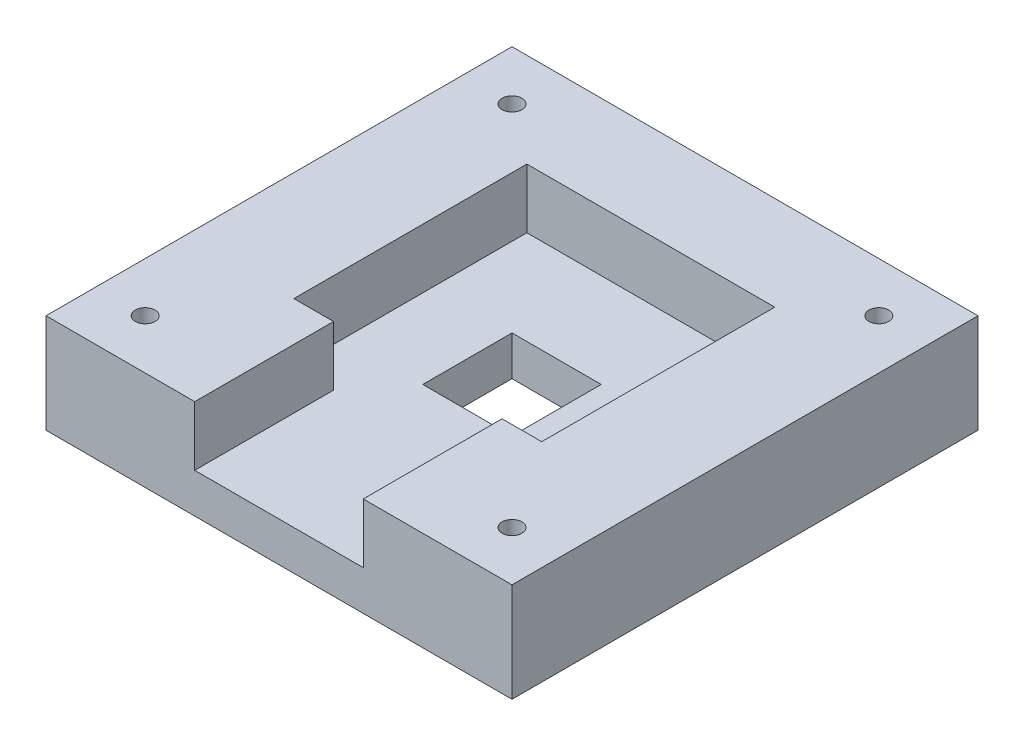
ISO-10303-21;
HEADER;
FILE_DESCRIPTION(('STEP AP214'),'2;1');
FILE_NAME('part.step','',(''),(''),'','','');
FILE_SCHEMA(('AUTOMOTIVE_DESIGN { 1 0 10303 214 1 1 1 1 }'));
ENDSEC;
DATA;
#1=APPLICATION_CONTEXT('core data for automotive mechanical design processes');
#2=APPLICATION_PROTOCOL_DEFINITION('international standard','automotive_design',2000,#1);
#3=PRODUCT_CONTEXT('',#1,'mechanical');
#4=PRODUCT('Part','Part','',(#3));
#5=PRODUCT_RELATED_PRODUCT_CATEGORY('part','',(#4));
#6=PRODUCT_DEFINITION_FORMATION('','',#4);
#7=PRODUCT_DEFINITION_CONTEXT('part definition',#1,'design');
#8=PRODUCT_DEFINITION('design','',#6,#7);
#9=PRODUCT_DEFINITION_SHAPE('','',#8);
#10=(LENGTH_UNIT() NAMED_UNIT(*) SI_UNIT(.MILLI.,.METRE.));
#11=(NAMED_UNIT(*) PLANE_ANGLE_UNIT() SI_UNIT($,.RADIAN.));
#12=(NAMED_UNIT(*) SI_UNIT($,.STERADIAN.) SOLID_ANGLE_UNIT());
#13=UNCERTAINTY_MEASURE_WITH_UNIT(LENGTH_MEASURE(1.E-05),#10,'distance_accuracy_value','');
#14=(GEOMETRIC_REPRESENTATION_CONTEXT(3) GLOBAL_UNCERTAINTY_ASSIGNED_CONTEXT((#13)) GLOBAL_UNIT_ASSIGNED_CONTEXT((#10,
#11,#12)) REPRESENTATION_CONTEXT('',''));
#15=CARTESIAN_POINT('',(0.,0.,0.));
#16=DIRECTION('',(0.,0.,1.));
#17=DIRECTION('',(1.,0.,0.));
#18=AXIS2_PLACEMENT_3D('',#15,#16,#17);
#19=CARTESIAN_POINT('',(0.,10.,47.));
#20=DIRECTION('',(0.,0.,-1.));
#21=DIRECTION('',(-1.,0.,0.));
#22=AXIS2_PLACEMENT_3D('',#19,#20,#21);
#23=PLANE('',#22);
#24=DIRECTION('',(0.,1.,0.));
#25=VECTOR('',#24,1.);
#26=CARTESIAN_POINT('',(32.,4.,47.));
#27=LINE('',#26,#25);
#28=CARTESIAN_POINT('',(32.,4.,47.));
#29=VERTEX_POINT('',#28);
#30=CARTESIAN_POINT('',(32.,10.,47.));
#31=VERTEX_POINT('',#30);
#32=EDGE_CURVE('E239',#29,#31,#27,.T.);
#33=ORIENTED_EDGE('',*,*,#32,.F.);
#34=DIRECTION('',(-1.,0.,0.));
#35=VECTOR('',#34,1.);
#36=CARTESIAN_POINT('',(32.,4.,47.));
#37=LINE('',#36,#35);
#38=CARTESIAN_POINT('',(15.,4.,47.));
#39=VERTEX_POINT('',#38);
#40=EDGE_CURVE('E241',#29,#39,#37,.T.);
#41=ORIENTED_EDGE('',*,*,#40,.T.);
#42=DIRECTION('',(0.,1.,0.));
#43=VECTOR('',#42,1.);
#44=CARTESIAN_POINT('',(15.,4.,47.));
#45=LINE('',#44,#43);
#46=CARTESIAN_POINT('',(15.,10.,47.));
#47=VERTEX_POINT('',#46);
#48=EDGE_CURVE('E158',#39,#47,#45,.T.);
#49=ORIENTED_EDGE('',*,*,#48,.T.);
#50=DIRECTION('',(1.,0.,0.));
#51=VECTOR('',#50,1.);
#52=CARTESIAN_POINT('',(0.,10.,47.));
#53=LINE('',#52,#51);
#54=CARTESIAN_POINT('',(0.,10.,47.));
#55=VERTEX_POINT('',#54);
#56=EDGE_CURVE('E339',#55,#47,#53,.T.);
#57=ORIENTED_EDGE('',*,*,#56,.F.);
#58=DIRECTION('',(0.,-1.,0.));
#59=VECTOR('',#58,1.);
#60=CARTESIAN_POINT('',(0.,10.,47.));
#61=LINE('',#60,#59);
#62=CARTESIAN_POINT('',(0.,0.,47.));
#63=VERTEX_POINT('',#62);
#64=EDGE_CURVE('E12',#55,#63,#61,.T.);
#65=ORIENTED_EDGE('',*,*,#64,.T.);
#66=DIRECTION('',(1.,0.,0.));
#67=VECTOR('',#66,1.);
#68=CARTESIAN_POINT('',(0.,0.,47.));
#69=LINE('',#68,#67);
#70=CARTESIAN_POINT('',(47.,0.,47.));
#71=VERTEX_POINT('',#70);
#72=EDGE_CURVE('E316',#63,#71,#69,.T.);
#73=ORIENTED_EDGE('',*,*,#72,.T.);
#74=DIRECTION('',(0.,-1.,0.));
#75=VECTOR('',#74,1.);
#76=CARTESIAN_POINT('',(47.,10.,47.));
#77=LINE('',#76,#75);
#78=CARTESIAN_POINT('',(47.,10.,47.));
#79=VERTEX_POINT('',#78);
#80=EDGE_CURVE('E45',#79,#71,#77,.T.);
#81=ORIENTED_EDGE('',*,*,#80,.F.);
#82=EDGE_CURVE('E39',#31,#79,#53,.T.);
#83=ORIENTED_EDGE('',*,*,#82,.F.);
#84=EDGE_LOOP('',(#33,#41,#49,#57,#65,#73,#81,#83));
#85=FACE_BOUND('',#84,.T.);
#86=ADVANCED_FACE('F35',(#85),#23,.F.);
#87=CARTESIAN_POINT('',(0.,10.,0.));
#88=DIRECTION('',(0.,1.,0.));
#89=DIRECTION('',(0.,0.,1.));
#90=AXIS2_PLACEMENT_3D('',#87,#88,#89);
#91=PLANE('',#90);
#92=CARTESIAN_POINT('',(42.,10.,42.));
#93=DIRECTION('',(0.,1.,0.));
#94=DIRECTION('',(0.,0.,1.));
#95=AXIS2_PLACEMENT_3D('',#92,#93,#94);
#96=CIRCLE('',#95,0.999999999999998);
#97=CARTESIAN_POINT('',(42.,10.,43.));
#98=VERTEX_POINT('',#97);
#99=EDGE_CURVE('E258',#98,#98,#96,.T.);
#100=ORIENTED_EDGE('',*,*,#99,.F.);
#101=EDGE_LOOP('',(#100));
#102=FACE_BOUND('',#101,.T.);
#103=CARTESIAN_POINT('',(5.,10.,42.));
#104=DIRECTION('',(0.,1.,0.));
#105=DIRECTION('',(0.,0.,1.));
#106=AXIS2_PLACEMENT_3D('',#103,#104,#105);
#107=CIRCLE('',#106,1.);
#108=CARTESIAN_POINT('',(5.,10.,43.));
#109=VERTEX_POINT('',#108);
#110=EDGE_CURVE('E272',#109,#109,#107,.T.);
#111=ORIENTED_EDGE('',*,*,#110,.F.);
#112=EDGE_LOOP('',(#111));
#113=FACE_BOUND('',#112,.T.);
#114=CARTESIAN_POINT('',(5.,10.,5.));
#115=DIRECTION('',(0.,1.,0.));
#116=DIRECTION('',(0.,0.,1.));
#117=AXIS2_PLACEMENT_3D('',#114,#115,#116);
#118=CIRCLE('',#117,1.);
#119=CARTESIAN_POINT('',(5.,10.,6.));
#120=VERTEX_POINT('',#119);
#121=EDGE_CURVE('E275',#120,#120,#118,.T.);
#122=ORIENTED_EDGE('',*,*,#121,.F.);
#123=EDGE_LOOP('',(#122));
#124=FACE_BOUND('',#123,.T.);
#125=CARTESIAN_POINT('',(42.,10.,5.));
#126=DIRECTION('',(0.,1.,0.));
#127=DIRECTION('',(0.,0.,1.));
#128=AXIS2_PLACEMENT_3D('',#125,#126,#127);
#129=CIRCLE('',#128,0.999999999999998);
#130=CARTESIAN_POINT('',(42.,10.,6.));
#131=VERTEX_POINT('',#130);
#132=EDGE_CURVE('E278',#131,#131,#129,.T.);
#133=ORIENTED_EDGE('',*,*,#132,.F.);
#134=EDGE_LOOP('',(#133));
#135=FACE_BOUND('',#134,.T.);
#136=DIRECTION('',(-1.,0.,0.));
#137=VECTOR('',#136,1.);
#138=CARTESIAN_POINT('',(36.,10.,33.));
#139=LINE('',#138,#137);
#140=CARTESIAN_POINT('',(36.,10.,33.));
#141=VERTEX_POINT('',#140);
#142=CARTESIAN_POINT('',(32.,10.,33.));
#143=VERTEX_POINT('',#142);
#144=EDGE_CURVE('E180',#141,#143,#139,.T.);
#145=ORIENTED_EDGE('',*,*,#144,.T.);
#146=DIRECTION('',(0.,0.,1.));
#147=VECTOR('',#146,1.);
#148=CARTESIAN_POINT('',(32.,10.,33.));
#149=LINE('',#148,#147);
#150=EDGE_CURVE('E254',#143,#31,#149,.T.);
#151=ORIENTED_EDGE('',*,*,#150,.T.);
#152=ORIENTED_EDGE('',*,*,#82,.T.);
#153=DIRECTION('',(0.,0.,-1.));
#154=VECTOR('',#153,1.);
#155=CARTESIAN_POINT('',(47.,10.,0.));
#156=LINE('',#155,#154);
#157=CARTESIAN_POINT('',(47.,10.,0.));
#158=VERTEX_POINT('',#157);
#159=EDGE_CURVE('E341',#79,#158,#156,.T.);
#160=ORIENTED_EDGE('',*,*,#159,.T.);
#161=DIRECTION('',(-1.,0.,0.));
#162=VECTOR('',#161,1.);
#163=CARTESIAN_POINT('',(0.,10.,0.));
#164=LINE('',#163,#162);
#165=CARTESIAN_POINT('',(0.,10.,0.));
#166=VERTEX_POINT('',#165);
#167=EDGE_CURVE('E327',#158,#166,#164,.T.);
#168=ORIENTED_EDGE('',*,*,#167,.T.);
#169=DIRECTION('',(0.,0.,1.));
#170=VECTOR('',#169,1.);
#171=CARTESIAN_POINT('',(0.,10.,0.));
#172=LINE('',#171,#170);
#173=EDGE_CURVE('E332',#166,#55,#172,.T.);
#174=ORIENTED_EDGE('',*,*,#173,.T.);
#175=ORIENTED_EDGE('',*,*,#56,.T.);
#176=DIRECTION('',(0.,0.,1.));
#177=VECTOR('',#176,1.);
#178=CARTESIAN_POINT('',(15.,10.,33.));
#179=LINE('',#178,#177);
#180=CARTESIAN_POINT('',(15.,10.,33.));
#181=VERTEX_POINT('',#180);
#182=EDGE_CURVE('E167',#181,#47,#179,.T.);
#183=ORIENTED_EDGE('',*,*,#182,.F.);
#184=CARTESIAN_POINT('',(11.,10.,33.));
#185=VERTEX_POINT('',#184);
#186=EDGE_CURVE('E53',#181,#185,#139,.T.);
#187=ORIENTED_EDGE('',*,*,#186,.T.);
#188=DIRECTION('',(0.,0.,1.));
#189=VECTOR('',#188,1.);
#190=CARTESIAN_POINT('',(11.,10.,9.5));
#191=LINE('',#190,#189);
#192=CARTESIAN_POINT('',(11.,10.,9.5));
#193=VERTEX_POINT('',#192);
#194=EDGE_CURVE('E213',#193,#185,#191,.T.);
#195=ORIENTED_EDGE('',*,*,#194,.F.);
#196=DIRECTION('',(-1.,0.,0.));
#197=VECTOR('',#196,1.);
#198=CARTESIAN_POINT('',(36.,10.,9.5));
#199=LINE('',#198,#197);
#200=CARTESIAN_POINT('',(36.,10.,9.5));
#201=VERTEX_POINT('',#200);
#202=EDGE_CURVE('E162',#201,#193,#199,.T.);
#203=ORIENTED_EDGE('',*,*,#202,.F.);
#204=DIRECTION('',(0.,0.,1.));
#205=VECTOR('',#204,1.);
#206=CARTESIAN_POINT('',(36.,10.,9.5));
#207=LINE('',#206,#205);
#208=EDGE_CURVE('E177',#201,#141,#207,.T.);
#209=ORIENTED_EDGE('',*,*,#208,.T.);
#210=EDGE_LOOP('',(#145,#151,#152,#160,#168,#174,#175,#183,#187,#195,#203,#209));
#211=FACE_BOUND('',#210,.T.);
#212=ADVANCED_FACE('F352',(#102,#113,#124,#135,#211),#91,.T.);
#213=CARTESIAN_POINT('',(0.,10.,0.));
#214=DIRECTION('',(1.,0.,0.));
#215=DIRECTION('',(0.,0.,-1.));
#216=AXIS2_PLACEMENT_3D('',#213,#214,#215);
#217=PLANE('',#216);
#218=DIRECTION('',(0.,0.,1.));
#219=VECTOR('',#218,1.);
#220=CARTESIAN_POINT('',(0.,0.,0.));
#221=LINE('',#220,#219);
#222=CARTESIAN_POINT('',(0.,0.,0.));
#223=VERTEX_POINT('',#222);
#224=EDGE_CURVE('E313',#223,#63,#221,.T.);
#225=ORIENTED_EDGE('',*,*,#224,.T.);
#226=ORIENTED_EDGE('',*,*,#64,.F.);
#227=ORIENTED_EDGE('',*,*,#173,.F.);
#228=DIRECTION('',(0.,-1.,0.));
#229=VECTOR('',#228,1.);
#230=CARTESIAN_POINT('',(0.,10.,0.));
#231=LINE('',#230,#229);
#232=EDGE_CURVE('E333',#166,#223,#231,.T.);
#233=ORIENTED_EDGE('',*,*,#232,.T.);
#234=EDGE_LOOP('',(#225,#226,#227,#233));
#235=FACE_BOUND('',#234,.T.);
#236=ADVANCED_FACE('F37',(#235),#217,.F.);
#237=CARTESIAN_POINT('',(47.,10.,0.));
#238=DIRECTION('',(-1.,0.,0.));
#239=DIRECTION('',(0.,0.,1.));
#240=AXIS2_PLACEMENT_3D('',#237,#238,#239);
#241=PLANE('',#240);
#242=DIRECTION('',(0.,0.,-1.));
#243=VECTOR('',#242,1.);
#244=CARTESIAN_POINT('',(47.,0.,0.));
#245=LINE('',#244,#243);
#246=CARTESIAN_POINT('',(47.,0.,0.));
#247=VERTEX_POINT('',#246);
#248=EDGE_CURVE('E322',#71,#247,#245,.T.);
#249=ORIENTED_EDGE('',*,*,#248,.T.);
#250=DIRECTION('',(0.,-1.,0.));
#251=VECTOR('',#250,1.);
#252=CARTESIAN_POINT('',(47.,10.,0.));
#253=LINE('',#252,#251);
#254=EDGE_CURVE('E335',#158,#247,#253,.T.);
#255=ORIENTED_EDGE('',*,*,#254,.F.);
#256=ORIENTED_EDGE('',*,*,#159,.F.);
#257=ORIENTED_EDGE('',*,*,#80,.T.);
#258=EDGE_LOOP('',(#249,#255,#256,#257));
#259=FACE_BOUND('',#258,.T.);
#260=ADVANCED_FACE('F361',(#259),#241,.F.);
#261=CARTESIAN_POINT('',(0.,10.,0.));
#262=DIRECTION('',(0.,0.,1.));
#263=DIRECTION('',(1.,0.,0.));
#264=AXIS2_PLACEMENT_3D('',#261,#262,#263);
#265=PLANE('',#264);
#266=DIRECTION('',(-1.,0.,0.));
#267=VECTOR('',#266,1.);
#268=CARTESIAN_POINT('',(0.,0.,0.));
#269=LINE('',#268,#267);
#270=EDGE_CURVE('E315',#247,#223,#269,.T.);
#271=ORIENTED_EDGE('',*,*,#270,.T.);
#272=ORIENTED_EDGE('',*,*,#232,.F.);
#273=ORIENTED_EDGE('',*,*,#167,.F.);
#274=ORIENTED_EDGE('',*,*,#254,.T.);
#275=EDGE_LOOP('',(#271,#272,#273,#274));
#276=FACE_BOUND('',#275,.T.);
#277=ADVANCED_FACE('F300',(#276),#265,.F.);
#278=CARTESIAN_POINT('',(0.,0.,0.));
#279=DIRECTION('',(0.,1.,0.));
#280=DIRECTION('',(0.,0.,1.));
#281=AXIS2_PLACEMENT_3D('',#278,#279,#280);
#282=PLANE('',#281);
#283=CARTESIAN_POINT('',(42.,0.,42.));
#284=DIRECTION('',(0.,-1.,0.));
#285=DIRECTION('',(0.,0.,-1.));
#286=AXIS2_PLACEMENT_3D('',#283,#284,#285);
#287=CIRCLE('',#286,0.999999999999998);
#288=CARTESIAN_POINT('',(42.,0.,41.));
#289=VERTEX_POINT('',#288);
#290=EDGE_CURVE('E285',#289,#289,#287,.T.);
#291=ORIENTED_EDGE('',*,*,#290,.F.);
#292=EDGE_LOOP('',(#291));
#293=FACE_BOUND('',#292,.T.);
#294=CARTESIAN_POINT('',(5.,0.,42.));
#295=DIRECTION('',(0.,-1.,0.));
#296=DIRECTION('',(0.,0.,-1.));
#297=AXIS2_PLACEMENT_3D('',#294,#295,#296);
#298=CIRCLE('',#297,1.);
#299=CARTESIAN_POINT('',(5.,0.,41.));
#300=VERTEX_POINT('',#299);
#301=EDGE_CURVE('E288',#300,#300,#298,.T.);
#302=ORIENTED_EDGE('',*,*,#301,.F.);
#303=EDGE_LOOP('',(#302));
#304=FACE_BOUND('',#303,.T.);
#305=CARTESIAN_POINT('',(5.,0.,5.));
#306=DIRECTION('',(0.,-1.,0.));
#307=DIRECTION('',(0.,0.,-1.));
#308=AXIS2_PLACEMENT_3D('',#305,#306,#307);
#309=CIRCLE('',#308,1.);
#310=CARTESIAN_POINT('',(5.,0.,4.));
#311=VERTEX_POINT('',#310);
#312=EDGE_CURVE('E284',#311,#311,#309,.T.);
#313=ORIENTED_EDGE('',*,*,#312,.F.);
#314=EDGE_LOOP('',(#313));
#315=FACE_BOUND('',#314,.T.);
#316=CARTESIAN_POINT('',(42.,0.,5.));
#317=DIRECTION('',(0.,-1.,0.));
#318=DIRECTION('',(0.,0.,-1.));
#319=AXIS2_PLACEMENT_3D('',#316,#317,#318);
#320=CIRCLE('',#319,0.999999999999998);
#321=CARTESIAN_POINT('',(42.,0.,4.));
#322=VERTEX_POINT('',#321);
#323=EDGE_CURVE('E281',#322,#322,#320,.T.);
#324=ORIENTED_EDGE('',*,*,#323,.F.);
#325=EDGE_LOOP('',(#324));
#326=FACE_BOUND('',#325,.T.);
#327=DIRECTION('',(-1.,0.,0.));
#328=VECTOR('',#327,1.);
#329=CARTESIAN_POINT('',(28.,0.,28.));
#330=LINE('',#329,#328);
#331=CARTESIAN_POINT('',(28.,0.,28.));
#332=VERTEX_POINT('',#331);
#333=CARTESIAN_POINT('',(19.,0.,28.));
#334=VERTEX_POINT('',#333);
#335=EDGE_CURVE('E309',#332,#334,#330,.T.);
#336=ORIENTED_EDGE('',*,*,#335,.F.);
#337=DIRECTION('',(0.,0.,1.));
#338=VECTOR('',#337,1.);
#339=CARTESIAN_POINT('',(28.,0.,19.));
#340=LINE('',#339,#338);
#341=CARTESIAN_POINT('',(28.,0.,19.));
#342=VERTEX_POINT('',#341);
#343=EDGE_CURVE('E61',#342,#332,#340,.T.);
#344=ORIENTED_EDGE('',*,*,#343,.F.);
#345=DIRECTION('',(1.,0.,0.));
#346=VECTOR('',#345,1.);
#347=CARTESIAN_POINT('',(28.,0.,19.));
#348=LINE('',#347,#346);
#349=CARTESIAN_POINT('',(19.,0.,19.));
#350=VERTEX_POINT('',#349);
#351=EDGE_CURVE('E582',#350,#342,#348,.T.);
#352=ORIENTED_EDGE('',*,*,#351,.F.);
#353=DIRECTION('',(0.,0.,-1.));
#354=VECTOR('',#353,1.);
#355=CARTESIAN_POINT('',(19.,0.,19.));
#356=LINE('',#355,#354);
#357=EDGE_CURVE('E592',#334,#350,#356,.T.);
#358=ORIENTED_EDGE('',*,*,#357,.F.);
#359=EDGE_LOOP('',(#336,#344,#352,#358));
#360=FACE_BOUND('',#359,.T.);
#361=ORIENTED_EDGE('',*,*,#224,.F.);
#362=ORIENTED_EDGE('',*,*,#270,.F.);
#363=ORIENTED_EDGE('',*,*,#248,.F.);
#364=ORIENTED_EDGE('',*,*,#72,.F.);
#365=EDGE_LOOP('',(#361,#362,#363,#364));
#366=FACE_BOUND('',#365,.T.);
#367=ADVANCED_FACE('F296',(#293,#304,#315,#326,#360,#366),#282,.F.);
#368=CARTESIAN_POINT('',(28.,4.,19.));
#369=DIRECTION('',(1.,0.,0.));
#370=DIRECTION('',(0.,0.,-1.));
#371=AXIS2_PLACEMENT_3D('',#368,#369,#370);
#372=PLANE('',#371);
#373=ORIENTED_EDGE('',*,*,#343,.T.);
#374=DIRECTION('',(0.,-1.,0.));
#375=VECTOR('',#374,1.);
#376=CARTESIAN_POINT('',(28.,4.,28.));
#377=LINE('',#376,#375);
#378=CARTESIAN_POINT('',(28.,4.,28.));
#379=VERTEX_POINT('',#378);
#380=EDGE_CURVE('E583',#379,#332,#377,.T.);
#381=ORIENTED_EDGE('',*,*,#380,.F.);
#382=DIRECTION('',(0.,0.,1.));
#383=VECTOR('',#382,1.);
#384=CARTESIAN_POINT('',(28.,4.,19.));
#385=LINE('',#384,#383);
#386=CARTESIAN_POINT('',(28.,4.,19.));
#387=VERTEX_POINT('',#386);
#388=EDGE_CURVE('E187',#387,#379,#385,.T.);
#389=ORIENTED_EDGE('',*,*,#388,.F.);
#390=DIRECTION('',(0.,-1.,0.));
#391=VECTOR('',#390,1.);
#392=CARTESIAN_POINT('',(28.,4.,19.));
#393=LINE('',#392,#391);
#394=EDGE_CURVE('E320',#387,#342,#393,.T.);
#395=ORIENTED_EDGE('',*,*,#394,.T.);
#396=EDGE_LOOP('',(#373,#381,#389,#395));
#397=FACE_BOUND('',#396,.T.);
#398=ADVANCED_FACE('F299',(#397),#372,.F.);
#399=CARTESIAN_POINT('',(28.,4.,19.));
#400=DIRECTION('',(0.,0.,-1.));
#401=DIRECTION('',(-1.,0.,0.));
#402=AXIS2_PLACEMENT_3D('',#399,#400,#401);
#403=PLANE('',#402);
#404=ORIENTED_EDGE('',*,*,#351,.T.);
#405=ORIENTED_EDGE('',*,*,#394,.F.);
#406=DIRECTION('',(1.,0.,0.));
#407=VECTOR('',#406,1.);
#408=CARTESIAN_POINT('',(28.,4.,19.));
#409=LINE('',#408,#407);
#410=CARTESIAN_POINT('',(19.,4.,19.));
#411=VERTEX_POINT('',#410);
#412=EDGE_CURVE('E580',#411,#387,#409,.T.);
#413=ORIENTED_EDGE('',*,*,#412,.F.);
#414=DIRECTION('',(0.,-1.,0.));
#415=VECTOR('',#414,1.);
#416=CARTESIAN_POINT('',(19.,4.,19.));
#417=LINE('',#416,#415);
#418=EDGE_CURVE('E324',#411,#350,#417,.T.);
#419=ORIENTED_EDGE('',*,*,#418,.T.);
#420=EDGE_LOOP('',(#404,#405,#413,#419));
#421=FACE_BOUND('',#420,.T.);
#422=ADVANCED_FACE('F384',(#421),#403,.F.);
#423=CARTESIAN_POINT('',(19.,4.,19.));
#424=DIRECTION('',(-1.,0.,0.));
#425=DIRECTION('',(0.,0.,1.));
#426=AXIS2_PLACEMENT_3D('',#423,#424,#425);
#427=PLANE('',#426);
#428=ORIENTED_EDGE('',*,*,#357,.T.);
#429=ORIENTED_EDGE('',*,*,#418,.F.);
#430=DIRECTION('',(0.,0.,-1.));
#431=VECTOR('',#430,1.);
#432=CARTESIAN_POINT('',(19.,4.,19.));
#433=LINE('',#432,#431);
#434=CARTESIAN_POINT('',(19.,4.,28.));
#435=VERTEX_POINT('',#434);
#436=EDGE_CURVE('E586',#435,#411,#433,.T.);
#437=ORIENTED_EDGE('',*,*,#436,.F.);
#438=DIRECTION('',(0.,-1.,0.));
#439=VECTOR('',#438,1.);
#440=CARTESIAN_POINT('',(19.,4.,28.));
#441=LINE('',#440,#439);
#442=EDGE_CURVE('E584',#435,#334,#441,.T.);
#443=ORIENTED_EDGE('',*,*,#442,.T.);
#444=EDGE_LOOP('',(#428,#429,#437,#443));
#445=FACE_BOUND('',#444,.T.);
#446=ADVANCED_FACE('F389',(#445),#427,.F.);
#447=CARTESIAN_POINT('',(28.,4.,28.));
#448=DIRECTION('',(0.,0.,1.));
#449=DIRECTION('',(1.,0.,0.));
#450=AXIS2_PLACEMENT_3D('',#447,#448,#449);
#451=PLANE('',#450);
#452=ORIENTED_EDGE('',*,*,#335,.T.);
#453=ORIENTED_EDGE('',*,*,#442,.F.);
#454=DIRECTION('',(-1.,0.,0.));
#455=VECTOR('',#454,1.);
#456=CARTESIAN_POINT('',(28.,4.,28.));
#457=LINE('',#456,#455);
#458=EDGE_CURVE('E577',#379,#435,#457,.T.);
#459=ORIENTED_EDGE('',*,*,#458,.F.);
#460=ORIENTED_EDGE('',*,*,#380,.T.);
#461=EDGE_LOOP('',(#452,#453,#459,#460));
#462=FACE_BOUND('',#461,.T.);
#463=ADVANCED_FACE('F385',(#462),#451,.F.);
#464=CARTESIAN_POINT('',(36.,4.,33.));
#465=DIRECTION('',(0.,0.,-1.));
#466=DIRECTION('',(-1.,0.,0.));
#467=AXIS2_PLACEMENT_3D('',#464,#465,#466);
#468=PLANE('',#467);
#469=DIRECTION('',(0.,1.,0.));
#470=VECTOR('',#469,1.);
#471=CARTESIAN_POINT('',(32.,4.,33.));
#472=LINE('',#471,#470);
#473=CARTESIAN_POINT('',(32.,4.,33.));
#474=VERTEX_POINT('',#473);
#475=EDGE_CURVE('E257',#474,#143,#472,.T.);
#476=ORIENTED_EDGE('',*,*,#475,.T.);
#477=ORIENTED_EDGE('',*,*,#144,.F.);
#478=DIRECTION('',(0.,1.,0.));
#479=VECTOR('',#478,1.);
#480=CARTESIAN_POINT('',(36.,4.,33.));
#481=LINE('',#480,#479);
#482=CARTESIAN_POINT('',(36.,4.,33.));
#483=VERTEX_POINT('',#482);
#484=EDGE_CURVE('E174',#483,#141,#481,.T.);
#485=ORIENTED_EDGE('',*,*,#484,.F.);
#486=DIRECTION('',(-1.,0.,0.));
#487=VECTOR('',#486,1.);
#488=CARTESIAN_POINT('',(36.,4.,33.));
#489=LINE('',#488,#487);
#490=EDGE_CURVE('E173',#483,#474,#489,.T.);
#491=ORIENTED_EDGE('',*,*,#490,.T.);
#492=EDGE_LOOP('',(#476,#477,#485,#491));
#493=FACE_BOUND('',#492,.T.);
#494=ADVANCED_FACE('F388',(#493),#468,.T.);
#495=CARTESIAN_POINT('',(0.,4.,0.));
#496=DIRECTION('',(0.,-1.,0.));
#497=DIRECTION('',(0.,0.,-1.));
#498=AXIS2_PLACEMENT_3D('',#495,#496,#497);
#499=PLANE('',#498);
#500=ORIENTED_EDGE('',*,*,#388,.T.);
#501=ORIENTED_EDGE('',*,*,#458,.T.);
#502=ORIENTED_EDGE('',*,*,#436,.T.);
#503=ORIENTED_EDGE('',*,*,#412,.T.);
#504=EDGE_LOOP('',(#500,#501,#502,#503));
#505=FACE_BOUND('',#504,.T.);
#506=DIRECTION('',(-1.,0.,0.));
#507=VECTOR('',#506,1.);
#508=CARTESIAN_POINT('',(36.,4.,9.5));
#509=LINE('',#508,#507);
#510=CARTESIAN_POINT('',(36.,4.,9.5));
#511=VERTEX_POINT('',#510);
#512=CARTESIAN_POINT('',(11.,4.,9.5));
#513=VERTEX_POINT('',#512);
#514=EDGE_CURVE('E221',#511,#513,#509,.T.);
#515=ORIENTED_EDGE('',*,*,#514,.T.);
#516=DIRECTION('',(0.,0.,1.));
#517=VECTOR('',#516,1.);
#518=CARTESIAN_POINT('',(11.,4.,9.5));
#519=LINE('',#518,#517);
#520=CARTESIAN_POINT('',(11.,4.,33.));
#521=VERTEX_POINT('',#520);
#522=EDGE_CURVE('E172',#513,#521,#519,.T.);
#523=ORIENTED_EDGE('',*,*,#522,.T.);
#524=CARTESIAN_POINT('',(15.,4.,33.));
#525=VERTEX_POINT('',#524);
#526=EDGE_CURVE('E165',#525,#521,#489,.T.);
#527=ORIENTED_EDGE('',*,*,#526,.F.);
#528=DIRECTION('',(0.,0.,1.));
#529=VECTOR('',#528,1.);
#530=CARTESIAN_POINT('',(15.,4.,33.));
#531=LINE('',#530,#529);
#532=EDGE_CURVE('E153',#525,#39,#531,.T.);
#533=ORIENTED_EDGE('',*,*,#532,.T.);
#534=ORIENTED_EDGE('',*,*,#40,.F.);
#535=DIRECTION('',(0.,0.,1.));
#536=VECTOR('',#535,1.);
#537=CARTESIAN_POINT('',(32.,4.,33.));
#538=LINE('',#537,#536);
#539=EDGE_CURVE('E242',#474,#29,#538,.T.);
#540=ORIENTED_EDGE('',*,*,#539,.F.);
#541=ORIENTED_EDGE('',*,*,#490,.F.);
#542=DIRECTION('',(0.,0.,1.));
#543=VECTOR('',#542,1.);
#544=CARTESIAN_POINT('',(36.,4.,9.5));
#545=LINE('',#544,#543);
#546=EDGE_CURVE('E197',#511,#483,#545,.T.);
#547=ORIENTED_EDGE('',*,*,#546,.F.);
#548=EDGE_LOOP('',(#515,#523,#527,#533,#534,#540,#541,#547));
#549=FACE_BOUND('',#548,.T.);
#550=ADVANCED_FACE('F171',(#505,#549),#499,.F.);
#551=CARTESIAN_POINT('',(36.,4.,9.5));
#552=DIRECTION('',(0.,0.,-1.));
#553=DIRECTION('',(-1.,0.,0.));
#554=AXIS2_PLACEMENT_3D('',#551,#552,#553);
#555=PLANE('',#554);
#556=ORIENTED_EDGE('',*,*,#202,.T.);
#557=DIRECTION('',(0.,1.,0.));
#558=VECTOR('',#557,1.);
#559=CARTESIAN_POINT('',(11.,4.,9.5));
#560=LINE('',#559,#558);
#561=EDGE_CURVE('E217',#513,#193,#560,.T.);
#562=ORIENTED_EDGE('',*,*,#561,.F.);
#563=ORIENTED_EDGE('',*,*,#514,.F.);
#564=DIRECTION('',(0.,1.,0.));
#565=VECTOR('',#564,1.);
#566=CARTESIAN_POINT('',(36.,4.,9.5));
#567=LINE('',#566,#565);
#568=EDGE_CURVE('E201',#511,#201,#567,.T.);
#569=ORIENTED_EDGE('',*,*,#568,.T.);
#570=EDGE_LOOP('',(#556,#562,#563,#569));
#571=FACE_BOUND('',#570,.T.);
#572=ADVANCED_FACE('F399',(#571),#555,.F.);
#573=CARTESIAN_POINT('',(11.,4.,9.5));
#574=DIRECTION('',(-1.,0.,0.));
#575=DIRECTION('',(0.,0.,1.));
#576=AXIS2_PLACEMENT_3D('',#573,#574,#575);
#577=PLANE('',#576);
#578=ORIENTED_EDGE('',*,*,#194,.T.);
#579=DIRECTION('',(0.,1.,0.));
#580=VECTOR('',#579,1.);
#581=CARTESIAN_POINT('',(11.,4.,33.));
#582=LINE('',#581,#580);
#583=EDGE_CURVE('E207',#521,#185,#582,.T.);
#584=ORIENTED_EDGE('',*,*,#583,.F.);
#585=ORIENTED_EDGE('',*,*,#522,.F.);
#586=ORIENTED_EDGE('',*,*,#561,.T.);
#587=EDGE_LOOP('',(#578,#584,#585,#586));
#588=FACE_BOUND('',#587,.T.);
#589=ADVANCED_FACE('F404',(#588),#577,.F.);
#590=CARTESIAN_POINT('',(36.,4.,9.5));
#591=DIRECTION('',(-1.,0.,0.));
#592=DIRECTION('',(0.,0.,1.));
#593=AXIS2_PLACEMENT_3D('',#590,#591,#592);
#594=PLANE('',#593);
#595=ORIENTED_EDGE('',*,*,#208,.F.);
#596=ORIENTED_EDGE('',*,*,#568,.F.);
#597=ORIENTED_EDGE('',*,*,#546,.T.);
#598=ORIENTED_EDGE('',*,*,#484,.T.);
#599=EDGE_LOOP('',(#595,#596,#597,#598));
#600=FACE_BOUND('',#599,.T.);
#601=ADVANCED_FACE('F401',(#600),#594,.T.);
#602=ORIENTED_EDGE('',*,*,#526,.T.);
#603=ORIENTED_EDGE('',*,*,#583,.T.);
#604=ORIENTED_EDGE('',*,*,#186,.F.);
#605=DIRECTION('',(0.,1.,0.));
#606=VECTOR('',#605,1.);
#607=CARTESIAN_POINT('',(15.,4.,33.));
#608=LINE('',#607,#606);
#609=EDGE_CURVE('E155',#525,#181,#608,.T.);
#610=ORIENTED_EDGE('',*,*,#609,.F.);
#611=EDGE_LOOP('',(#602,#603,#604,#610));
#612=FACE_BOUND('',#611,.T.);
#613=ADVANCED_FACE('F164',(#612),#468,.T.);
#614=CARTESIAN_POINT('',(32.,4.,33.));
#615=DIRECTION('',(-1.,0.,0.));
#616=DIRECTION('',(0.,0.,1.));
#617=AXIS2_PLACEMENT_3D('',#614,#615,#616);
#618=PLANE('',#617);
#619=ORIENTED_EDGE('',*,*,#150,.F.);
#620=ORIENTED_EDGE('',*,*,#475,.F.);
#621=ORIENTED_EDGE('',*,*,#539,.T.);
#622=ORIENTED_EDGE('',*,*,#32,.T.);
#623=EDGE_LOOP('',(#619,#620,#621,#622));
#624=FACE_BOUND('',#623,.T.);
#625=ADVANCED_FACE('F408',(#624),#618,.T.);
#626=CARTESIAN_POINT('',(15.,4.,33.));
#627=DIRECTION('',(-1.,0.,0.));
#628=DIRECTION('',(0.,0.,1.));
#629=AXIS2_PLACEMENT_3D('',#626,#627,#628);
#630=PLANE('',#629);
#631=ORIENTED_EDGE('',*,*,#182,.T.);
#632=ORIENTED_EDGE('',*,*,#48,.F.);
#633=ORIENTED_EDGE('',*,*,#532,.F.);
#634=ORIENTED_EDGE('',*,*,#609,.T.);
#635=EDGE_LOOP('',(#631,#632,#633,#634));
#636=FACE_BOUND('',#635,.T.);
#637=ADVANCED_FACE('F154',(#636),#630,.F.);
#638=CARTESIAN_POINT('',(42.,10.0001030776407,5.));
#639=DIRECTION('',(0.,-1.,0.));
#640=DIRECTION('',(0.,0.,-1.));
#641=AXIS2_PLACEMENT_3D('',#638,#639,#640);
#642=CYLINDRICAL_SURFACE('',#641,0.999999999999998);
#643=ORIENTED_EDGE('',*,*,#132,.T.);
#644=EDGE_LOOP('',(#643));
#645=FACE_BOUND('',#644,.T.);
#646=ORIENTED_EDGE('',*,*,#323,.T.);
#647=EDGE_LOOP('',(#646));
#648=FACE_BOUND('',#647,.T.);
#649=ADVANCED_FACE('F416',(#645,#648),#642,.F.);
#650=CARTESIAN_POINT('',(5.,10.0001030776407,5.));
#651=DIRECTION('',(0.,-1.,0.));
#652=DIRECTION('',(0.,0.,-1.));
#653=AXIS2_PLACEMENT_3D('',#650,#651,#652);
#654=CYLINDRICAL_SURFACE('',#653,1.);
#655=ORIENTED_EDGE('',*,*,#121,.T.);
#656=EDGE_LOOP('',(#655));
#657=FACE_BOUND('',#656,.T.);
#658=ORIENTED_EDGE('',*,*,#312,.T.);
#659=EDGE_LOOP('',(#658));
#660=FACE_BOUND('',#659,.T.);
#661=ADVANCED_FACE('F294',(#657,#660),#654,.F.);
#662=CARTESIAN_POINT('',(5.,10.0001030776407,42.));
#663=DIRECTION('',(0.,-1.,0.));
#664=DIRECTION('',(0.,0.,-1.));
#665=AXIS2_PLACEMENT_3D('',#662,#663,#664);
#666=CYLINDRICAL_SURFACE('',#665,1.);
#667=ORIENTED_EDGE('',*,*,#110,.T.);
#668=EDGE_LOOP('',(#667));
#669=FACE_BOUND('',#668,.T.);
#670=ORIENTED_EDGE('',*,*,#301,.T.);
#671=EDGE_LOOP('',(#670));
#672=FACE_BOUND('',#671,.T.);
#673=ADVANCED_FACE('F426',(#669,#672),#666,.F.);
#674=CARTESIAN_POINT('',(42.,10.0001030776407,42.));
#675=DIRECTION('',(0.,-1.,0.));
#676=DIRECTION('',(0.,0.,-1.));
#677=AXIS2_PLACEMENT_3D('',#674,#675,#676);
#678=CYLINDRICAL_SURFACE('',#677,0.999999999999998);
#679=ORIENTED_EDGE('',*,*,#99,.T.);
#680=EDGE_LOOP('',(#679));
#681=FACE_BOUND('',#680,.T.);
#682=ORIENTED_EDGE('',*,*,#290,.T.);
#683=EDGE_LOOP('',(#682));
#684=FACE_BOUND('',#683,.T.);
#685=ADVANCED_FACE('F423',(#681,#684),#678,.F.);
#686=CLOSED_SHELL('',(#86,#212,#236,#260,#277,#367,#398,#422,#446,#463,#494,#550,#572,#589,#601,
#613,#625,#637,#649,#661,#673,#685));
#687=MANIFOLD_SOLID_BREP('B2',#686);
#688=ADVANCED_BREP_SHAPE_REPRESENTATION('',(#18,#687),#14);
#689=SHAPE_DEFINITION_REPRESENTATION(#9,#688);
ENDSEC;
END-ISO-10303-21;
